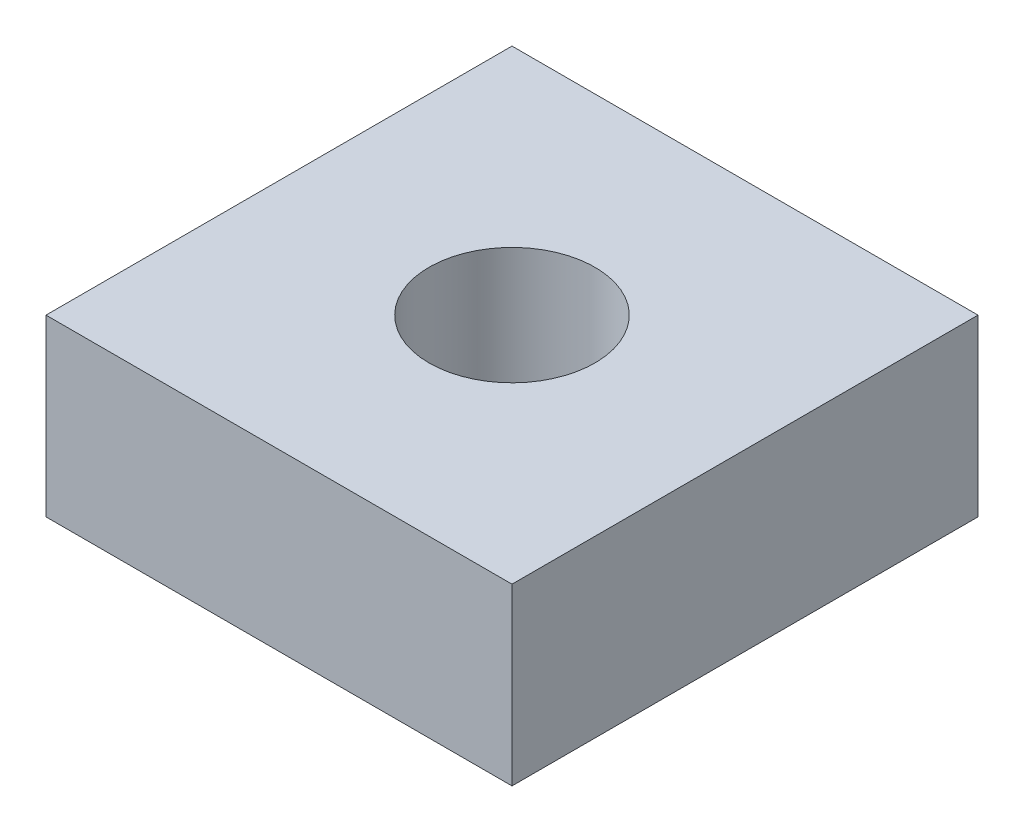
ISO-10303-21;
HEADER;
FILE_DESCRIPTION(('STEP AP214'),'2;1');
FILE_NAME('part.step','',(''),(''),'','','');
FILE_SCHEMA(('AUTOMOTIVE_DESIGN { 1 0 10303 214 1 1 1 1 }'));
ENDSEC;
DATA;
#1=APPLICATION_CONTEXT('core data for automotive mechanical design processes');
#2=APPLICATION_PROTOCOL_DEFINITION('international standard','automotive_design',2000,#1);
#3=PRODUCT_CONTEXT('',#1,'mechanical');
#4=PRODUCT('Part','Part','',(#3));
#5=PRODUCT_RELATED_PRODUCT_CATEGORY('part','',(#4));
#6=PRODUCT_DEFINITION_FORMATION('','',#4);
#7=PRODUCT_DEFINITION_CONTEXT('part definition',#1,'design');
#8=PRODUCT_DEFINITION('design','',#6,#7);
#9=PRODUCT_DEFINITION_SHAPE('','',#8);
#10=(LENGTH_UNIT() NAMED_UNIT(*) SI_UNIT(.MILLI.,.METRE.));
#11=(NAMED_UNIT(*) PLANE_ANGLE_UNIT() SI_UNIT($,.RADIAN.));
#12=(NAMED_UNIT(*) SI_UNIT($,.STERADIAN.) SOLID_ANGLE_UNIT());
#13=UNCERTAINTY_MEASURE_WITH_UNIT(LENGTH_MEASURE(1.E-05),#10,'distance_accuracy_value','');
#14=(GEOMETRIC_REPRESENTATION_CONTEXT(3) GLOBAL_UNCERTAINTY_ASSIGNED_CONTEXT((#13)) GLOBAL_UNIT_ASSIGNED_CONTEXT((#10,
#11,#12)) REPRESENTATION_CONTEXT('',''));
#15=CARTESIAN_POINT('',(0.,0.,0.));
#16=DIRECTION('',(0.,0.,1.));
#17=DIRECTION('',(1.,0.,0.));
#18=AXIS2_PLACEMENT_3D('',#15,#16,#17);
#19=CARTESIAN_POINT('',(3.175,2.38125,3.175));
#20=DIRECTION('',(-1.,0.,0.));
#21=DIRECTION('',(0.,0.,1.));
#22=AXIS2_PLACEMENT_3D('',#19,#20,#21);
#23=PLANE('',#22);
#24=DIRECTION('',(0.,0.,-1.));
#25=VECTOR('',#24,1.);
#26=CARTESIAN_POINT('',(3.175,0.,3.175));
#27=LINE('',#26,#25);
#28=CARTESIAN_POINT('',(3.175,0.,3.175));
#29=VERTEX_POINT('',#28);
#30=CARTESIAN_POINT('',(3.175,0.,-3.175));
#31=VERTEX_POINT('',#30);
#32=EDGE_CURVE('E98',#29,#31,#27,.T.);
#33=ORIENTED_EDGE('',*,*,#32,.T.);
#34=DIRECTION('',(0.,-1.,0.));
#35=VECTOR('',#34,1.);
#36=CARTESIAN_POINT('',(3.175,2.38125,-3.175));
#37=LINE('',#36,#35);
#38=CARTESIAN_POINT('',(3.175,2.38125,-3.175));
#39=VERTEX_POINT('',#38);
#40=EDGE_CURVE('E11',#39,#31,#37,.T.);
#41=ORIENTED_EDGE('',*,*,#40,.F.);
#42=DIRECTION('',(0.,0.,-1.));
#43=VECTOR('',#42,1.);
#44=CARTESIAN_POINT('',(3.175,2.38125,3.175));
#45=LINE('',#44,#43);
#46=CARTESIAN_POINT('',(3.175,2.38125,3.175));
#47=VERTEX_POINT('',#46);
#48=EDGE_CURVE('E86',#47,#39,#45,.T.);
#49=ORIENTED_EDGE('',*,*,#48,.F.);
#50=DIRECTION('',(0.,-1.,0.));
#51=VECTOR('',#50,1.);
#52=CARTESIAN_POINT('',(3.175,2.38125,3.175));
#53=LINE('',#52,#51);
#54=EDGE_CURVE('E94',#47,#29,#53,.T.);
#55=ORIENTED_EDGE('',*,*,#54,.T.);
#56=EDGE_LOOP('',(#33,#41,#49,#55));
#57=FACE_BOUND('',#56,.T.);
#58=ADVANCED_FACE('F35',(#57),#23,.F.);
#59=CARTESIAN_POINT('',(-3.175,2.38125,-3.175));
#60=DIRECTION('',(0.,0.,1.));
#61=DIRECTION('',(1.,0.,0.));
#62=AXIS2_PLACEMENT_3D('',#59,#60,#61);
#63=PLANE('',#62);
#64=DIRECTION('',(-1.,0.,0.));
#65=VECTOR('',#64,1.);
#66=CARTESIAN_POINT('',(-3.175,0.,-3.175));
#67=LINE('',#66,#65);
#68=CARTESIAN_POINT('',(-3.175,0.,-3.175));
#69=VERTEX_POINT('',#68);
#70=EDGE_CURVE('E90',#31,#69,#67,.T.);
#71=ORIENTED_EDGE('',*,*,#70,.T.);
#72=DIRECTION('',(0.,-1.,0.));
#73=VECTOR('',#72,1.);
#74=CARTESIAN_POINT('',(-3.175,2.38125,-3.175));
#75=LINE('',#74,#73);
#76=CARTESIAN_POINT('',(-3.175,2.38125,-3.175));
#77=VERTEX_POINT('',#76);
#78=EDGE_CURVE('E43',#77,#69,#75,.T.);
#79=ORIENTED_EDGE('',*,*,#78,.F.);
#80=DIRECTION('',(-1.,0.,0.));
#81=VECTOR('',#80,1.);
#82=CARTESIAN_POINT('',(-3.175,2.38125,-3.175));
#83=LINE('',#82,#81);
#84=EDGE_CURVE('E81',#39,#77,#83,.T.);
#85=ORIENTED_EDGE('',*,*,#84,.F.);
#86=ORIENTED_EDGE('',*,*,#40,.T.);
#87=EDGE_LOOP('',(#71,#79,#85,#86));
#88=FACE_BOUND('',#87,.T.);
#89=ADVANCED_FACE('F89',(#88),#63,.F.);
#90=CARTESIAN_POINT('',(-3.175,2.38125,3.175));
#91=DIRECTION('',(1.,0.,0.));
#92=DIRECTION('',(0.,0.,-1.));
#93=AXIS2_PLACEMENT_3D('',#90,#91,#92);
#94=PLANE('',#93);
#95=DIRECTION('',(0.,0.,1.));
#96=VECTOR('',#95,1.);
#97=CARTESIAN_POINT('',(-3.175,0.,3.175));
#98=LINE('',#97,#96);
#99=CARTESIAN_POINT('',(-3.175,0.,3.175));
#100=VERTEX_POINT('',#99);
#101=EDGE_CURVE('E68',#69,#100,#98,.T.);
#102=ORIENTED_EDGE('',*,*,#101,.T.);
#103=DIRECTION('',(0.,-1.,0.));
#104=VECTOR('',#103,1.);
#105=CARTESIAN_POINT('',(-3.175,2.38125,3.175));
#106=LINE('',#105,#104);
#107=CARTESIAN_POINT('',(-3.175,2.38125,3.175));
#108=VERTEX_POINT('',#107);
#109=EDGE_CURVE('E91',#108,#100,#106,.T.);
#110=ORIENTED_EDGE('',*,*,#109,.F.);
#111=DIRECTION('',(0.,0.,1.));
#112=VECTOR('',#111,1.);
#113=CARTESIAN_POINT('',(-3.175,2.38125,3.175));
#114=LINE('',#113,#112);
#115=EDGE_CURVE('E84',#77,#108,#114,.T.);
#116=ORIENTED_EDGE('',*,*,#115,.F.);
#117=ORIENTED_EDGE('',*,*,#78,.T.);
#118=EDGE_LOOP('',(#102,#110,#116,#117));
#119=FACE_BOUND('',#118,.T.);
#120=ADVANCED_FACE('F92',(#119),#94,.F.);
#121=CARTESIAN_POINT('',(-3.175,2.38125,3.175));
#122=DIRECTION('',(0.,0.,-1.));
#123=DIRECTION('',(-1.,0.,0.));
#124=AXIS2_PLACEMENT_3D('',#121,#122,#123);
#125=PLANE('',#124);
#126=DIRECTION('',(1.,0.,0.));
#127=VECTOR('',#126,1.);
#128=CARTESIAN_POINT('',(-3.175,0.,3.175));
#129=LINE('',#128,#127);
#130=EDGE_CURVE('E74',#100,#29,#129,.T.);
#131=ORIENTED_EDGE('',*,*,#130,.T.);
#132=ORIENTED_EDGE('',*,*,#54,.F.);
#133=DIRECTION('',(1.,0.,0.));
#134=VECTOR('',#133,1.);
#135=CARTESIAN_POINT('',(-3.175,2.38125,3.175));
#136=LINE('',#135,#134);
#137=EDGE_CURVE('E51',#108,#47,#136,.T.);
#138=ORIENTED_EDGE('',*,*,#137,.F.);
#139=ORIENTED_EDGE('',*,*,#109,.T.);
#140=EDGE_LOOP('',(#131,#132,#138,#139));
#141=FACE_BOUND('',#140,.T.);
#142=ADVANCED_FACE('F106',(#141),#125,.F.);
#143=CARTESIAN_POINT('',(0.,2.38125,0.));
#144=DIRECTION('',(0.,-1.,0.));
#145=DIRECTION('',(0.,0.,-1.));
#146=AXIS2_PLACEMENT_3D('',#143,#144,#145);
#147=PLANE('',#146);
#148=CARTESIAN_POINT('',(0.,2.38125,0.));
#149=DIRECTION('',(0.,1.,0.));
#150=DIRECTION('',(0.,0.,1.));
#151=AXIS2_PLACEMENT_3D('',#148,#149,#150);
#152=CIRCLE('',#151,1.1303);
#153=CARTESIAN_POINT('',(0.,2.38125,1.1303));
#154=VERTEX_POINT('',#153);
#155=EDGE_CURVE('E114',#154,#154,#152,.T.);
#156=ORIENTED_EDGE('',*,*,#155,.F.);
#157=EDGE_LOOP('',(#156));
#158=FACE_BOUND('',#157,.T.);
#159=ORIENTED_EDGE('',*,*,#48,.T.);
#160=ORIENTED_EDGE('',*,*,#84,.T.);
#161=ORIENTED_EDGE('',*,*,#115,.T.);
#162=ORIENTED_EDGE('',*,*,#137,.T.);
#163=EDGE_LOOP('',(#159,#160,#161,#162));
#164=FACE_BOUND('',#163,.T.);
#165=ADVANCED_FACE('F82',(#158,#164),#147,.F.);
#166=CARTESIAN_POINT('',(0.,0.,0.));
#167=DIRECTION('',(0.,-1.,0.));
#168=DIRECTION('',(0.,0.,-1.));
#169=AXIS2_PLACEMENT_3D('',#166,#167,#168);
#170=PLANE('',#169);
#171=CARTESIAN_POINT('',(0.,0.,0.));
#172=DIRECTION('',(0.,1.,0.));
#173=DIRECTION('',(0.,0.,1.));
#174=AXIS2_PLACEMENT_3D('',#171,#172,#173);
#175=CIRCLE('',#174,1.1303);
#176=CARTESIAN_POINT('',(0.,0.,1.1303));
#177=VERTEX_POINT('',#176);
#178=EDGE_CURVE('E101',#177,#177,#175,.T.);
#179=ORIENTED_EDGE('',*,*,#178,.T.);
#180=EDGE_LOOP('',(#179));
#181=FACE_BOUND('',#180,.T.);
#182=ORIENTED_EDGE('',*,*,#32,.F.);
#183=ORIENTED_EDGE('',*,*,#130,.F.);
#184=ORIENTED_EDGE('',*,*,#101,.F.);
#185=ORIENTED_EDGE('',*,*,#70,.F.);
#186=EDGE_LOOP('',(#182,#183,#184,#185));
#187=FACE_BOUND('',#186,.T.);
#188=ADVANCED_FACE('F109',(#181,#187),#170,.T.);
#189=CARTESIAN_POINT('',(0.,2.38125,0.));
#190=DIRECTION('',(0.,1.,0.));
#191=DIRECTION('',(0.,0.,1.));
#192=AXIS2_PLACEMENT_3D('',#189,#190,#191);
#193=CYLINDRICAL_SURFACE('',#192,1.1303);
#194=ORIENTED_EDGE('',*,*,#178,.F.);
#195=EDGE_LOOP('',(#194));
#196=FACE_BOUND('',#195,.T.);
#197=ORIENTED_EDGE('',*,*,#155,.T.);
#198=EDGE_LOOP('',(#197));
#199=FACE_BOUND('',#198,.T.);
#200=ADVANCED_FACE('F118',(#196,#199),#193,.F.);
#201=CLOSED_SHELL('',(#58,#89,#120,#142,#165,#188,#200));
#202=MANIFOLD_SOLID_BREP('B2',#201);
#203=ADVANCED_BREP_SHAPE_REPRESENTATION('',(#18,#202),#14);
#204=SHAPE_DEFINITION_REPRESENTATION(#9,#203);
ENDSEC;
END-ISO-10303-21;
